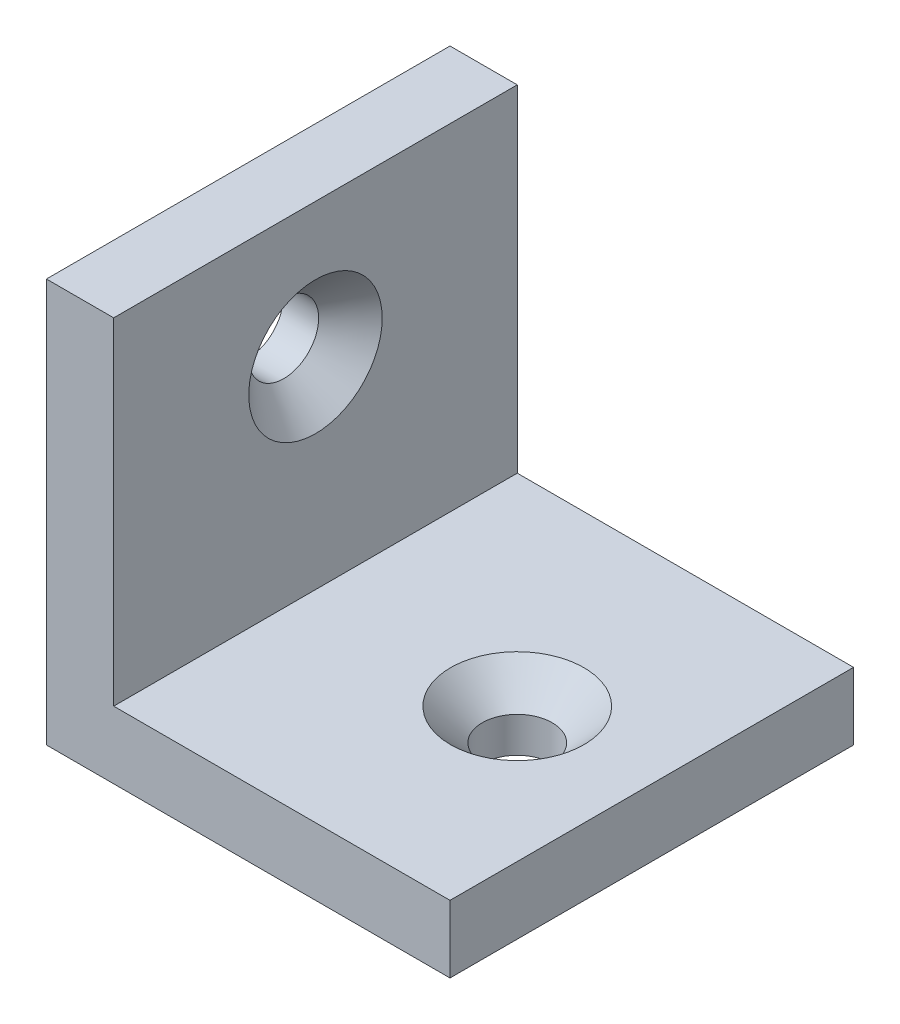
ISO-10303-21;
HEADER;
FILE_DESCRIPTION(('STEP AP214'),'2;1');
FILE_NAME('part.step','',(''),(''),'','','');
FILE_SCHEMA(('AUTOMOTIVE_DESIGN { 1 0 10303 214 1 1 1 1 }'));
ENDSEC;
DATA;
#1=APPLICATION_CONTEXT('core data for automotive mechanical design processes');
#2=APPLICATION_PROTOCOL_DEFINITION('international standard','automotive_design',2000,#1);
#3=PRODUCT_CONTEXT('',#1,'mechanical');
#4=PRODUCT('Part','Part','',(#3));
#5=PRODUCT_RELATED_PRODUCT_CATEGORY('part','',(#4));
#6=PRODUCT_DEFINITION_FORMATION('','',#4);
#7=PRODUCT_DEFINITION_CONTEXT('part definition',#1,'design');
#8=PRODUCT_DEFINITION('design','',#6,#7);
#9=PRODUCT_DEFINITION_SHAPE('','',#8);
#10=(LENGTH_UNIT() NAMED_UNIT(*) SI_UNIT(.MILLI.,.METRE.));
#11=(NAMED_UNIT(*) PLANE_ANGLE_UNIT() SI_UNIT($,.RADIAN.));
#12=(NAMED_UNIT(*) SI_UNIT($,.STERADIAN.) SOLID_ANGLE_UNIT());
#13=UNCERTAINTY_MEASURE_WITH_UNIT(LENGTH_MEASURE(1.E-05),#10,'distance_accuracy_value','');
#14=(GEOMETRIC_REPRESENTATION_CONTEXT(3) GLOBAL_UNCERTAINTY_ASSIGNED_CONTEXT((#13)) GLOBAL_UNIT_ASSIGNED_CONTEXT((#10,
#11,#12)) REPRESENTATION_CONTEXT('',''));
#15=CARTESIAN_POINT('',(0.,0.,0.));
#16=DIRECTION('',(0.,0.,1.));
#17=DIRECTION('',(1.,0.,0.));
#18=AXIS2_PLACEMENT_3D('',#15,#16,#17);
#19=CARTESIAN_POINT('',(0.,6.35,19.05));
#20=DIRECTION('',(0.,1.,0.));
#21=DIRECTION('',(0.,0.,1.));
#22=AXIS2_PLACEMENT_3D('',#19,#20,#21);
#23=PLANE('',#22);
#24=CARTESIAN_POINT('',(25.4,6.35,0.));
#25=DIRECTION('',(0.,1.,0.));
#26=DIRECTION('',(0.,0.,1.));
#27=AXIS2_PLACEMENT_3D('',#24,#25,#26);
#28=CIRCLE('',#27,6.3);
#29=CARTESIAN_POINT('',(25.4,6.35,6.3));
#30=VERTEX_POINT('',#29);
#31=EDGE_CURVE('E161',#30,#30,#28,.T.);
#32=ORIENTED_EDGE('',*,*,#31,.F.);
#33=EDGE_LOOP('',(#32));
#34=FACE_BOUND('',#33,.T.);
#35=DIRECTION('',(1.,0.,0.));
#36=VECTOR('',#35,1.);
#37=CARTESIAN_POINT('',(0.,6.35,-19.05));
#38=LINE('',#37,#36);
#39=CARTESIAN_POINT('',(6.35,6.35,-19.05));
#40=VERTEX_POINT('',#39);
#41=CARTESIAN_POINT('',(38.1,6.35,-19.05));
#42=VERTEX_POINT('',#41);
#43=EDGE_CURVE('E116',#40,#42,#38,.T.);
#44=ORIENTED_EDGE('',*,*,#43,.F.);
#45=DIRECTION('',(0.,0.,-1.));
#46=VECTOR('',#45,1.);
#47=CARTESIAN_POINT('',(6.35,6.35,19.05));
#48=LINE('',#47,#46);
#49=CARTESIAN_POINT('',(6.35,6.35,19.05));
#50=VERTEX_POINT('',#49);
#51=EDGE_CURVE('E11',#50,#40,#48,.T.);
#52=ORIENTED_EDGE('',*,*,#51,.F.);
#53=DIRECTION('',(1.,0.,0.));
#54=VECTOR('',#53,1.);
#55=CARTESIAN_POINT('',(0.,6.35,19.05));
#56=LINE('',#55,#54);
#57=CARTESIAN_POINT('',(38.1,6.35,19.05));
#58=VERTEX_POINT('',#57);
#59=EDGE_CURVE('E130',#50,#58,#56,.T.);
#60=ORIENTED_EDGE('',*,*,#59,.T.);
#61=DIRECTION('',(0.,0.,-1.));
#62=VECTOR('',#61,1.);
#63=CARTESIAN_POINT('',(38.1,6.35,19.05));
#64=LINE('',#63,#62);
#65=EDGE_CURVE('E78',#58,#42,#64,.T.);
#66=ORIENTED_EDGE('',*,*,#65,.T.);
#67=EDGE_LOOP('',(#44,#52,#60,#66));
#68=FACE_BOUND('',#67,.T.);
#69=ADVANCED_FACE('F34',(#34,#68),#23,.T.);
#70=CARTESIAN_POINT('',(6.35,0.,19.05));
#71=DIRECTION('',(-1.,0.,0.));
#72=DIRECTION('',(0.,0.,1.));
#73=AXIS2_PLACEMENT_3D('',#70,#71,#72);
#74=PLANE('',#73);
#75=CARTESIAN_POINT('',(6.35,25.4,0.));
#76=DIRECTION('',(1.,0.,0.));
#77=DIRECTION('',(0.,0.,-1.));
#78=AXIS2_PLACEMENT_3D('',#75,#76,#77);
#79=CIRCLE('',#78,6.3);
#80=CARTESIAN_POINT('',(6.35,25.4,-6.3));
#81=VERTEX_POINT('',#80);
#82=EDGE_CURVE('E152',#81,#81,#79,.T.);
#83=ORIENTED_EDGE('',*,*,#82,.F.);
#84=EDGE_LOOP('',(#83));
#85=FACE_BOUND('',#84,.T.);
#86=DIRECTION('',(0.,1.,0.));
#87=VECTOR('',#86,1.);
#88=CARTESIAN_POINT('',(6.35,0.,-19.05));
#89=LINE('',#88,#87);
#90=CARTESIAN_POINT('',(6.35,38.1,-19.05));
#91=VERTEX_POINT('',#90);
#92=EDGE_CURVE('E119',#40,#91,#89,.T.);
#93=ORIENTED_EDGE('',*,*,#92,.T.);
#94=DIRECTION('',(0.,0.,-1.));
#95=VECTOR('',#94,1.);
#96=CARTESIAN_POINT('',(6.35,38.1,19.05));
#97=LINE('',#96,#95);
#98=CARTESIAN_POINT('',(6.35,38.1,19.05));
#99=VERTEX_POINT('',#98);
#100=EDGE_CURVE('E42',#99,#91,#97,.T.);
#101=ORIENTED_EDGE('',*,*,#100,.F.);
#102=DIRECTION('',(0.,1.,0.));
#103=VECTOR('',#102,1.);
#104=CARTESIAN_POINT('',(6.35,0.,19.05));
#105=LINE('',#104,#103);
#106=EDGE_CURVE('E111',#50,#99,#105,.T.);
#107=ORIENTED_EDGE('',*,*,#106,.F.);
#108=ORIENTED_EDGE('',*,*,#51,.T.);
#109=EDGE_LOOP('',(#93,#101,#107,#108));
#110=FACE_BOUND('',#109,.T.);
#111=ADVANCED_FACE('F139',(#85,#110),#74,.F.);
#112=CARTESIAN_POINT('',(0.,38.1,19.05));
#113=DIRECTION('',(0.,1.,0.));
#114=DIRECTION('',(0.,0.,1.));
#115=AXIS2_PLACEMENT_3D('',#112,#113,#114);
#116=PLANE('',#115);
#117=DIRECTION('',(1.,0.,0.));
#118=VECTOR('',#117,1.);
#119=CARTESIAN_POINT('',(0.,38.1,-19.05));
#120=LINE('',#119,#118);
#121=CARTESIAN_POINT('',(0.,38.1,-19.05));
#122=VERTEX_POINT('',#121);
#123=EDGE_CURVE('E123',#122,#91,#120,.T.);
#124=ORIENTED_EDGE('',*,*,#123,.F.);
#125=DIRECTION('',(0.,0.,-1.));
#126=VECTOR('',#125,1.);
#127=CARTESIAN_POINT('',(0.,38.1,19.05));
#128=LINE('',#127,#126);
#129=CARTESIAN_POINT('',(0.,38.1,19.05));
#130=VERTEX_POINT('',#129);
#131=EDGE_CURVE('E100',#130,#122,#128,.T.);
#132=ORIENTED_EDGE('',*,*,#131,.F.);
#133=DIRECTION('',(1.,0.,0.));
#134=VECTOR('',#133,1.);
#135=CARTESIAN_POINT('',(0.,38.1,19.05));
#136=LINE('',#135,#134);
#137=EDGE_CURVE('E109',#130,#99,#136,.T.);
#138=ORIENTED_EDGE('',*,*,#137,.T.);
#139=ORIENTED_EDGE('',*,*,#100,.T.);
#140=EDGE_LOOP('',(#124,#132,#138,#139));
#141=FACE_BOUND('',#140,.T.);
#142=ADVANCED_FACE('F136',(#141),#116,.T.);
#143=CARTESIAN_POINT('',(0.,0.,19.05));
#144=DIRECTION('',(-1.,0.,0.));
#145=DIRECTION('',(0.,0.,1.));
#146=AXIS2_PLACEMENT_3D('',#143,#144,#145);
#147=PLANE('',#146);
#148=CARTESIAN_POINT('',(0.,25.4,0.));
#149=DIRECTION('',(1.,0.,0.));
#150=DIRECTION('',(0.,0.,-1.));
#151=AXIS2_PLACEMENT_3D('',#148,#149,#150);
#152=CIRCLE('',#151,3.3);
#153=CARTESIAN_POINT('',(0.,25.4,-3.3));
#154=VERTEX_POINT('',#153);
#155=EDGE_CURVE('E120',#154,#154,#152,.T.);
#156=ORIENTED_EDGE('',*,*,#155,.T.);
#157=EDGE_LOOP('',(#156));
#158=FACE_BOUND('',#157,.T.);
#159=DIRECTION('',(0.,1.,0.));
#160=VECTOR('',#159,1.);
#161=CARTESIAN_POINT('',(0.,0.,-19.05));
#162=LINE('',#161,#160);
#163=CARTESIAN_POINT('',(0.,0.,-19.05));
#164=VERTEX_POINT('',#163);
#165=EDGE_CURVE('E99',#164,#122,#162,.T.);
#166=ORIENTED_EDGE('',*,*,#165,.F.);
#167=DIRECTION('',(0.,0.,-1.));
#168=VECTOR('',#167,1.);
#169=CARTESIAN_POINT('',(0.,0.,19.05));
#170=LINE('',#169,#168);
#171=CARTESIAN_POINT('',(0.,0.,19.05));
#172=VERTEX_POINT('',#171);
#173=EDGE_CURVE('E93',#172,#164,#170,.T.);
#174=ORIENTED_EDGE('',*,*,#173,.F.);
#175=DIRECTION('',(0.,1.,0.));
#176=VECTOR('',#175,1.);
#177=CARTESIAN_POINT('',(0.,0.,19.05));
#178=LINE('',#177,#176);
#179=EDGE_CURVE('E97',#172,#130,#178,.T.);
#180=ORIENTED_EDGE('',*,*,#179,.T.);
#181=ORIENTED_EDGE('',*,*,#131,.T.);
#182=EDGE_LOOP('',(#166,#174,#180,#181));
#183=FACE_BOUND('',#182,.T.);
#184=ADVANCED_FACE('F95',(#158,#183),#147,.T.);
#185=CARTESIAN_POINT('',(0.,0.,19.05));
#186=DIRECTION('',(0.,1.,0.));
#187=DIRECTION('',(0.,0.,1.));
#188=AXIS2_PLACEMENT_3D('',#185,#186,#187);
#189=PLANE('',#188);
#190=CARTESIAN_POINT('',(25.4,0.,0.));
#191=DIRECTION('',(0.,1.,0.));
#192=DIRECTION('',(0.,0.,1.));
#193=AXIS2_PLACEMENT_3D('',#190,#191,#192);
#194=CIRCLE('',#193,3.3);
#195=CARTESIAN_POINT('',(25.4,0.,3.3));
#196=VERTEX_POINT('',#195);
#197=EDGE_CURVE('E155',#196,#196,#194,.T.);
#198=ORIENTED_EDGE('',*,*,#197,.T.);
#199=EDGE_LOOP('',(#198));
#200=FACE_BOUND('',#199,.T.);
#201=DIRECTION('',(1.,0.,0.));
#202=VECTOR('',#201,1.);
#203=CARTESIAN_POINT('',(0.,0.,-19.05));
#204=LINE('',#203,#202);
#205=CARTESIAN_POINT('',(38.1,0.,-19.05));
#206=VERTEX_POINT('',#205);
#207=EDGE_CURVE('E71',#164,#206,#204,.T.);
#208=ORIENTED_EDGE('',*,*,#207,.T.);
#209=DIRECTION('',(0.,0.,-1.));
#210=VECTOR('',#209,1.);
#211=CARTESIAN_POINT('',(38.1,0.,19.05));
#212=LINE('',#211,#210);
#213=CARTESIAN_POINT('',(38.1,0.,19.05));
#214=VERTEX_POINT('',#213);
#215=EDGE_CURVE('E101',#214,#206,#212,.T.);
#216=ORIENTED_EDGE('',*,*,#215,.F.);
#217=DIRECTION('',(1.,0.,0.));
#218=VECTOR('',#217,1.);
#219=CARTESIAN_POINT('',(0.,0.,19.05));
#220=LINE('',#219,#218);
#221=EDGE_CURVE('E103',#172,#214,#220,.T.);
#222=ORIENTED_EDGE('',*,*,#221,.F.);
#223=ORIENTED_EDGE('',*,*,#173,.T.);
#224=EDGE_LOOP('',(#208,#216,#222,#223));
#225=FACE_BOUND('',#224,.T.);
#226=ADVANCED_FACE('F104',(#200,#225),#189,.F.);
#227=CARTESIAN_POINT('',(38.1,0.,19.05));
#228=DIRECTION('',(-1.,0.,0.));
#229=DIRECTION('',(0.,0.,1.));
#230=AXIS2_PLACEMENT_3D('',#227,#228,#229);
#231=PLANE('',#230);
#232=DIRECTION('',(0.,1.,0.));
#233=VECTOR('',#232,1.);
#234=CARTESIAN_POINT('',(38.1,0.,-19.05));
#235=LINE('',#234,#233);
#236=EDGE_CURVE('E128',#206,#42,#235,.T.);
#237=ORIENTED_EDGE('',*,*,#236,.T.);
#238=ORIENTED_EDGE('',*,*,#65,.F.);
#239=DIRECTION('',(0.,1.,0.));
#240=VECTOR('',#239,1.);
#241=CARTESIAN_POINT('',(38.1,0.,19.05));
#242=LINE('',#241,#240);
#243=EDGE_CURVE('E50',#214,#58,#242,.T.);
#244=ORIENTED_EDGE('',*,*,#243,.F.);
#245=ORIENTED_EDGE('',*,*,#215,.T.);
#246=EDGE_LOOP('',(#237,#238,#244,#245));
#247=FACE_BOUND('',#246,.T.);
#248=ADVANCED_FACE('F144',(#247),#231,.F.);
#249=CARTESIAN_POINT('',(0.,0.,19.05));
#250=DIRECTION('',(0.,0.,1.));
#251=DIRECTION('',(1.,0.,0.));
#252=AXIS2_PLACEMENT_3D('',#249,#250,#251);
#253=PLANE('',#252);
#254=ORIENTED_EDGE('',*,*,#59,.F.);
#255=ORIENTED_EDGE('',*,*,#106,.T.);
#256=ORIENTED_EDGE('',*,*,#137,.F.);
#257=ORIENTED_EDGE('',*,*,#179,.F.);
#258=ORIENTED_EDGE('',*,*,#221,.T.);
#259=ORIENTED_EDGE('',*,*,#243,.T.);
#260=EDGE_LOOP('',(#254,#255,#256,#257,#258,#259));
#261=FACE_BOUND('',#260,.T.);
#262=ADVANCED_FACE('F107',(#261),#253,.T.);
#263=CARTESIAN_POINT('',(0.,0.,-19.05));
#264=DIRECTION('',(0.,0.,1.));
#265=DIRECTION('',(1.,0.,0.));
#266=AXIS2_PLACEMENT_3D('',#263,#264,#265);
#267=PLANE('',#266);
#268=ORIENTED_EDGE('',*,*,#43,.T.);
#269=ORIENTED_EDGE('',*,*,#236,.F.);
#270=ORIENTED_EDGE('',*,*,#207,.F.);
#271=ORIENTED_EDGE('',*,*,#165,.T.);
#272=ORIENTED_EDGE('',*,*,#123,.T.);
#273=ORIENTED_EDGE('',*,*,#92,.F.);
#274=EDGE_LOOP('',(#268,#269,#270,#271,#272,#273));
#275=FACE_BOUND('',#274,.T.);
#276=ADVANCED_FACE('F141',(#275),#267,.F.);
#277=CARTESIAN_POINT('',(6.35,25.4,0.));
#278=DIRECTION('',(1.,0.,0.));
#279=DIRECTION('',(0.,0.,-1.));
#280=AXIS2_PLACEMENT_3D('',#277,#278,#279);
#281=CYLINDRICAL_SURFACE('',#280,3.3);
#282=ORIENTED_EDGE('',*,*,#155,.F.);
#283=EDGE_LOOP('',(#282));
#284=FACE_BOUND('',#283,.T.);
#285=CARTESIAN_POINT('',(3.35,25.4,0.));
#286=DIRECTION('',(1.,0.,0.));
#287=DIRECTION('',(0.,0.,-1.));
#288=AXIS2_PLACEMENT_3D('',#285,#286,#287);
#289=CIRCLE('',#288,3.3);
#290=CARTESIAN_POINT('',(3.35,25.4,-3.3));
#291=VERTEX_POINT('',#290);
#292=EDGE_CURVE('E149',#291,#291,#289,.T.);
#293=ORIENTED_EDGE('',*,*,#292,.T.);
#294=EDGE_LOOP('',(#293));
#295=FACE_BOUND('',#294,.T.);
#296=ADVANCED_FACE('F188',(#284,#295),#281,.F.);
#297=CARTESIAN_POINT('',(6.35,25.4,0.));
#298=DIRECTION('',(1.,0.,0.));
#299=DIRECTION('',(0.,0.,-1.));
#300=AXIS2_PLACEMENT_3D('',#297,#298,#299);
#301=CONICAL_SURFACE('',#300,6.3,0.785398163397448);
#302=ORIENTED_EDGE('',*,*,#292,.F.);
#303=EDGE_LOOP('',(#302));
#304=FACE_BOUND('',#303,.T.);
#305=ORIENTED_EDGE('',*,*,#82,.T.);
#306=EDGE_LOOP('',(#305));
#307=FACE_BOUND('',#306,.T.);
#308=ADVANCED_FACE('F193',(#304,#307),#301,.F.);
#309=CARTESIAN_POINT('',(25.4,6.35,0.));
#310=DIRECTION('',(0.,1.,0.));
#311=DIRECTION('',(0.,0.,1.));
#312=AXIS2_PLACEMENT_3D('',#309,#310,#311);
#313=CYLINDRICAL_SURFACE('',#312,3.29999999999999);
#314=ORIENTED_EDGE('',*,*,#197,.F.);
#315=EDGE_LOOP('',(#314));
#316=FACE_BOUND('',#315,.T.);
#317=CARTESIAN_POINT('',(25.4,3.34999999999999,0.));
#318=DIRECTION('',(0.,1.,0.));
#319=DIRECTION('',(0.,0.,1.));
#320=AXIS2_PLACEMENT_3D('',#317,#318,#319);
#321=CIRCLE('',#320,3.29999999999999);
#322=CARTESIAN_POINT('',(25.4,3.34999999999999,3.29999999999999));
#323=VERTEX_POINT('',#322);
#324=EDGE_CURVE('E158',#323,#323,#321,.T.);
#325=ORIENTED_EDGE('',*,*,#324,.T.);
#326=EDGE_LOOP('',(#325));
#327=FACE_BOUND('',#326,.T.);
#328=ADVANCED_FACE('F197',(#316,#327),#313,.F.);
#329=CARTESIAN_POINT('',(25.4,6.35,0.));
#330=DIRECTION('',(0.,1.,0.));
#331=DIRECTION('',(0.,0.,1.));
#332=AXIS2_PLACEMENT_3D('',#329,#330,#331);
#333=CONICAL_SURFACE('',#332,6.3,0.785398163397448);
#334=ORIENTED_EDGE('',*,*,#324,.F.);
#335=EDGE_LOOP('',(#334));
#336=FACE_BOUND('',#335,.T.);
#337=ORIENTED_EDGE('',*,*,#31,.T.);
#338=EDGE_LOOP('',(#337));
#339=FACE_BOUND('',#338,.T.);
#340=ADVANCED_FACE('F165',(#336,#339),#333,.F.);
#341=CLOSED_SHELL('',(#69,#111,#142,#184,#226,#248,#262,#276,#296,#308,#328,#340));
#342=MANIFOLD_SOLID_BREP('B2',#341);
#343=ADVANCED_BREP_SHAPE_REPRESENTATION('',(#18,#342),#14);
#344=SHAPE_DEFINITION_REPRESENTATION(#9,#343);
ENDSEC;
END-ISO-10303-21;
